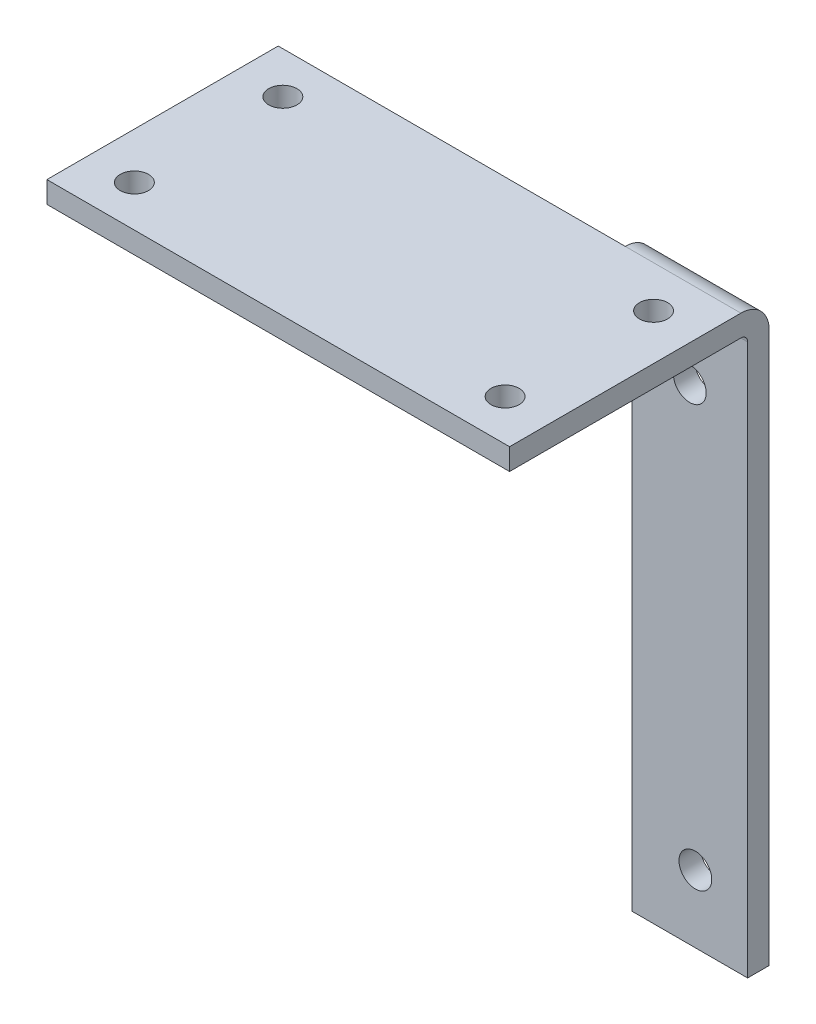
ISO-10303-21;
HEADER;
FILE_DESCRIPTION(('STEP AP214'),'2;1');
FILE_NAME('part.step','',(''),(''),'','','');
FILE_SCHEMA(('AUTOMOTIVE_DESIGN { 1 0 10303 214 1 1 1 1 }'));
ENDSEC;
DATA;
#1=APPLICATION_CONTEXT('core data for automotive mechanical design processes');
#2=APPLICATION_PROTOCOL_DEFINITION('international standard','automotive_design',2000,#1);
#3=PRODUCT_CONTEXT('',#1,'mechanical');
#4=PRODUCT('Part','Part','',(#3));
#5=PRODUCT_RELATED_PRODUCT_CATEGORY('part','',(#4));
#6=PRODUCT_DEFINITION_FORMATION('','',#4);
#7=PRODUCT_DEFINITION_CONTEXT('part definition',#1,'design');
#8=PRODUCT_DEFINITION('design','',#6,#7);
#9=PRODUCT_DEFINITION_SHAPE('','',#8);
#10=(LENGTH_UNIT() NAMED_UNIT(*) SI_UNIT(.MILLI.,.METRE.));
#11=(NAMED_UNIT(*) PLANE_ANGLE_UNIT() SI_UNIT($,.RADIAN.));
#12=(NAMED_UNIT(*) SI_UNIT($,.STERADIAN.) SOLID_ANGLE_UNIT());
#13=UNCERTAINTY_MEASURE_WITH_UNIT(LENGTH_MEASURE(1.E-05),#10,'distance_accuracy_value','');
#14=(GEOMETRIC_REPRESENTATION_CONTEXT(3) GLOBAL_UNCERTAINTY_ASSIGNED_CONTEXT((#13)) GLOBAL_UNIT_ASSIGNED_CONTEXT((#10,
#11,#12)) REPRESENTATION_CONTEXT('',''));
#15=CARTESIAN_POINT('',(0.,0.,0.));
#16=DIRECTION('',(0.,0.,1.));
#17=DIRECTION('',(1.,0.,0.));
#18=AXIS2_PLACEMENT_3D('',#15,#16,#17);
#19=CARTESIAN_POINT('',(0.,25.3135161158946,-26.1366000000001));
#20=DIRECTION('',(0.,0.,1.));
#21=DIRECTION('',(0.,-1.,0.));
#22=AXIS2_PLACEMENT_3D('',#19,#20,#21);
#23=PLANE('',#22);
#24=CARTESIAN_POINT('',(45.06468,-56.1900038841054,-26.1365999999998));
#25=DIRECTION('',(0.,0.,-1.));
#26=DIRECTION('',(0.,1.,0.));
#27=AXIS2_PLACEMENT_3D('',#24,#25,#26);
#28=CIRCLE('',#27,1.79958999999998);
#29=CARTESIAN_POINT('',(45.06468,-54.3904138841054,-26.1365999999998));
#30=VERTEX_POINT('',#29);
#31=EDGE_CURVE('E186',#30,#30,#28,.T.);
#32=ORIENTED_EDGE('',*,*,#31,.T.);
#33=EDGE_LOOP('',(#32));
#34=FACE_BOUND('',#33,.T.);
#35=CARTESIAN_POINT('',(44.45,-10.2464838841054,-26.1366));
#36=DIRECTION('',(0.,0.,-1.));
#37=DIRECTION('',(0.,1.,0.));
#38=AXIS2_PLACEMENT_3D('',#35,#36,#37);
#39=CIRCLE('',#38,1.79958999999999);
#40=CARTESIAN_POINT('',(44.45,-8.44689388410542,-26.1366));
#41=VERTEX_POINT('',#40);
#42=EDGE_CURVE('E221',#41,#41,#39,.T.);
#43=ORIENTED_EDGE('',*,*,#42,.T.);
#44=EDGE_LOOP('',(#43));
#45=FACE_BOUND('',#44,.T.);
#46=DIRECTION('',(1.,0.,0.));
#47=VECTOR('',#46,1.);
#48=CARTESIAN_POINT('',(50.8,-63.5864838841054,-26.1365999999998));
#49=LINE('',#48,#47);
#50=CARTESIAN_POINT('',(50.8,-63.5864838841054,-26.1365999999999));
#51=VERTEX_POINT('',#50);
#52=CARTESIAN_POINT('',(38.1,-63.5864838841054,-26.1365999999998));
#53=VERTEX_POINT('',#52);
#54=EDGE_CURVE('E182',#51,#53,#49,.F.);
#55=ORIENTED_EDGE('',*,*,#54,.F.);
#56=DIRECTION('',(0.,1.,0.));
#57=VECTOR('',#56,1.);
#58=CARTESIAN_POINT('',(50.8,-63.5864838841054,-26.1366));
#59=LINE('',#58,#57);
#60=CARTESIAN_POINT('',(50.8,-3.09880000000001,-26.1366));
#61=VERTEX_POINT('',#60);
#62=EDGE_CURVE('E71',#61,#51,#59,.F.);
#63=ORIENTED_EDGE('',*,*,#62,.F.);
#64=DIRECTION('',(1.,0.,0.));
#65=VECTOR('',#64,1.);
#66=CARTESIAN_POINT('',(31.1856101828211,-3.0988,-26.1366));
#67=LINE('',#66,#65);
#68=CARTESIAN_POINT('',(38.1,-3.0988,-26.1365999999999));
#69=VERTEX_POINT('',#68);
#70=EDGE_CURVE('E189',#61,#69,#67,.F.);
#71=ORIENTED_EDGE('',*,*,#70,.T.);
#72=DIRECTION('',(0.,-1.,0.));
#73=VECTOR('',#72,1.);
#74=CARTESIAN_POINT('',(38.1,-0.0864838841054226,-26.1365999999998));
#75=LINE('',#74,#73);
#76=EDGE_CURVE('E149',#53,#69,#75,.F.);
#77=ORIENTED_EDGE('',*,*,#76,.F.);
#78=EDGE_LOOP('',(#55,#63,#71,#77));
#79=FACE_BOUND('',#78,.T.);
#80=ADVANCED_FACE('F17',(#34,#45,#79),#23,.T.);
#81=CARTESIAN_POINT('',(31.1856101828211,-3.0988,-25.4));
#82=DIRECTION('',(1.,0.,0.));
#83=DIRECTION('',(0.,0.,-1.));
#84=AXIS2_PLACEMENT_3D('',#81,#82,#83);
#85=CYLINDRICAL_SURFACE('',#84,0.7366);
#86=DIRECTION('',(1.,0.,0.));
#87=VECTOR('',#86,1.);
#88=CARTESIAN_POINT('',(0.,-2.3622,-25.4));
#89=LINE('',#88,#87);
#90=CARTESIAN_POINT('',(38.1,-2.3622,-25.4));
#91=VERTEX_POINT('',#90);
#92=CARTESIAN_POINT('',(50.8,-2.3622,-25.4));
#93=VERTEX_POINT('',#92);
#94=EDGE_CURVE('E145',#91,#93,#89,.T.);
#95=ORIENTED_EDGE('',*,*,#94,.F.);
#96=CARTESIAN_POINT('',(38.1,-3.0988,-25.4));
#97=DIRECTION('',(1.,0.,0.));
#98=DIRECTION('',(0.,0.,-1.));
#99=AXIS2_PLACEMENT_3D('',#96,#97,#98);
#100=CIRCLE('',#99,0.7366);
#101=EDGE_CURVE('E20',#69,#91,#100,.T.);
#102=ORIENTED_EDGE('',*,*,#101,.F.);
#103=ORIENTED_EDGE('',*,*,#70,.F.);
#104=CARTESIAN_POINT('',(50.8,-3.0988,-25.4));
#105=DIRECTION('',(1.,0.,0.));
#106=DIRECTION('',(0.,0.,-1.));
#107=AXIS2_PLACEMENT_3D('',#104,#105,#106);
#108=CIRCLE('',#107,0.7366);
#109=EDGE_CURVE('E223',#93,#61,#108,.F.);
#110=ORIENTED_EDGE('',*,*,#109,.F.);
#111=EDGE_LOOP('',(#95,#102,#103,#110));
#112=FACE_BOUND('',#111,.T.);
#113=ADVANCED_FACE('F230',(#112),#85,.F.);
#114=CARTESIAN_POINT('',(44.45,-10.2464838841054,-26.1366));
#115=DIRECTION('',(0.,0.,-1.));
#116=DIRECTION('',(0.,1.,0.));
#117=AXIS2_PLACEMENT_3D('',#114,#115,#116);
#118=CYLINDRICAL_SURFACE('',#117,1.79958999999999);
#119=ORIENTED_EDGE('',*,*,#42,.F.);
#120=EDGE_LOOP('',(#119));
#121=FACE_BOUND('',#120,.T.);
#122=CARTESIAN_POINT('',(44.45,-10.2464838841054,-28.4988));
#123=DIRECTION('',(0.,0.,-1.));
#124=DIRECTION('',(0.,1.,0.));
#125=AXIS2_PLACEMENT_3D('',#122,#123,#124);
#126=CIRCLE('',#125,1.79958999999999);
#127=CARTESIAN_POINT('',(44.45,-8.44689388410543,-28.4988));
#128=VERTEX_POINT('',#127);
#129=EDGE_CURVE('E148',#128,#128,#126,.T.);
#130=ORIENTED_EDGE('',*,*,#129,.T.);
#131=EDGE_LOOP('',(#130));
#132=FACE_BOUND('',#131,.T.);
#133=ADVANCED_FACE('F258',(#121,#132),#118,.F.);
#134=CARTESIAN_POINT('',(45.06468,-56.1900038841054,-26.1365999999998));
#135=DIRECTION('',(0.,0.,-1.));
#136=DIRECTION('',(0.,1.,0.));
#137=AXIS2_PLACEMENT_3D('',#134,#135,#136);
#138=CYLINDRICAL_SURFACE('',#137,1.79958999999998);
#139=ORIENTED_EDGE('',*,*,#31,.F.);
#140=EDGE_LOOP('',(#139));
#141=FACE_BOUND('',#140,.T.);
#142=CARTESIAN_POINT('',(45.06468,-56.1900038841054,-28.4987999999998));
#143=DIRECTION('',(0.,0.,-1.));
#144=DIRECTION('',(0.,1.,0.));
#145=AXIS2_PLACEMENT_3D('',#142,#143,#144);
#146=CIRCLE('',#145,1.79958999999998);
#147=CARTESIAN_POINT('',(45.06468,-54.3904138841054,-28.4987999999998));
#148=VERTEX_POINT('',#147);
#149=EDGE_CURVE('E175',#148,#148,#146,.T.);
#150=ORIENTED_EDGE('',*,*,#149,.T.);
#151=EDGE_LOOP('',(#150));
#152=FACE_BOUND('',#151,.T.);
#153=ADVANCED_FACE('F250',(#141,#152),#138,.F.);
#154=CARTESIAN_POINT('',(50.8,-63.5864838841054,-26.1365999999998));
#155=DIRECTION('',(0.,-1.,0.));
#156=DIRECTION('',(0.,0.,-1.));
#157=AXIS2_PLACEMENT_3D('',#154,#155,#156);
#158=PLANE('',#157);
#159=ORIENTED_EDGE('',*,*,#54,.T.);
#160=DIRECTION('',(0.,0.,1.));
#161=VECTOR('',#160,1.);
#162=CARTESIAN_POINT('',(38.1,-63.5864838841054,-26.1366));
#163=LINE('',#162,#161);
#164=CARTESIAN_POINT('',(38.1,-63.5864838841054,-28.4987999999998));
#165=VERTEX_POINT('',#164);
#166=EDGE_CURVE('E165',#165,#53,#163,.T.);
#167=ORIENTED_EDGE('',*,*,#166,.F.);
#168=DIRECTION('',(1.,0.,0.));
#169=VECTOR('',#168,1.);
#170=CARTESIAN_POINT('',(0.,-63.5864838841054,-28.4987999999998));
#171=LINE('',#170,#169);
#172=CARTESIAN_POINT('',(50.8,-63.5864838841054,-28.4987999999998));
#173=VERTEX_POINT('',#172);
#174=EDGE_CURVE('E142',#165,#173,#171,.T.);
#175=ORIENTED_EDGE('',*,*,#174,.T.);
#176=DIRECTION('',(0.,0.,1.));
#177=VECTOR('',#176,1.);
#178=CARTESIAN_POINT('',(50.8,-63.5864838841054,-26.1365999999998));
#179=LINE('',#178,#177);
#180=EDGE_CURVE('E170',#51,#173,#179,.F.);
#181=ORIENTED_EDGE('',*,*,#180,.F.);
#182=EDGE_LOOP('',(#159,#167,#175,#181));
#183=FACE_BOUND('',#182,.T.);
#184=ADVANCED_FACE('F248',(#183),#158,.T.);
#185=CARTESIAN_POINT('',(0.,-2.3622,0.));
#186=DIRECTION('',(0.,-1.,0.));
#187=DIRECTION('',(0.,0.,-1.));
#188=AXIS2_PLACEMENT_3D('',#185,#186,#187);
#189=PLANE('',#188);
#190=DIRECTION('',(1.,0.,0.));
#191=VECTOR('',#190,1.);
#192=CARTESIAN_POINT('',(0.,-2.3622,0.));
#193=LINE('',#192,#191);
#194=CARTESIAN_POINT('',(0.,-2.3622,0.));
#195=VERTEX_POINT('',#194);
#196=CARTESIAN_POINT('',(50.8,-2.3622,0.));
#197=VERTEX_POINT('',#196);
#198=EDGE_CURVE('E154',#195,#197,#193,.T.);
#199=ORIENTED_EDGE('',*,*,#198,.F.);
#200=DIRECTION('',(0.,0.,1.));
#201=VECTOR('',#200,1.);
#202=CARTESIAN_POINT('',(0.,-2.3622,0.));
#203=LINE('',#202,#201);
#204=CARTESIAN_POINT('',(0.,-2.3622,-25.4));
#205=VERTEX_POINT('',#204);
#206=EDGE_CURVE('E99',#205,#195,#203,.T.);
#207=ORIENTED_EDGE('',*,*,#206,.F.);
#208=DIRECTION('',(-1.,0.,0.));
#209=VECTOR('',#208,1.);
#210=CARTESIAN_POINT('',(0.,-2.3622,-25.4));
#211=LINE('',#210,#209);
#212=EDGE_CURVE('E125',#91,#205,#211,.T.);
#213=ORIENTED_EDGE('',*,*,#212,.F.);
#214=ORIENTED_EDGE('',*,*,#94,.T.);
#215=DIRECTION('',(0.,0.,-1.));
#216=VECTOR('',#215,1.);
#217=CARTESIAN_POINT('',(50.8,-2.3622,-88.9));
#218=LINE('',#217,#216);
#219=EDGE_CURVE('E151',#197,#93,#218,.T.);
#220=ORIENTED_EDGE('',*,*,#219,.F.);
#221=EDGE_LOOP('',(#199,#207,#213,#214,#220));
#222=FACE_BOUND('',#221,.T.);
#223=CARTESIAN_POINT('',(45.78,-2.3622,-20.8280000000001));
#224=DIRECTION('',(0.,1.,0.));
#225=DIRECTION('',(0.,0.,1.));
#226=AXIS2_PLACEMENT_3D('',#223,#224,#225);
#227=CIRCLE('',#226,1.54999999999999);
#228=CARTESIAN_POINT('',(45.78,-2.3622,-19.2780000000001));
#229=VERTEX_POINT('',#228);
#230=EDGE_CURVE('E155',#229,#229,#227,.T.);
#231=ORIENTED_EDGE('',*,*,#230,.T.);
#232=EDGE_LOOP('',(#231));
#233=FACE_BOUND('',#232,.T.);
#234=CARTESIAN_POINT('',(5.08,-2.3622,-4.52800000000005));
#235=DIRECTION('',(0.,1.,0.));
#236=DIRECTION('',(0.,0.,1.));
#237=AXIS2_PLACEMENT_3D('',#234,#235,#236);
#238=CIRCLE('',#237,1.54999999999999);
#239=CARTESIAN_POINT('',(5.08,-2.3622,-2.97800000000006));
#240=VERTEX_POINT('',#239);
#241=EDGE_CURVE('E207',#240,#240,#238,.T.);
#242=ORIENTED_EDGE('',*,*,#241,.T.);
#243=EDGE_LOOP('',(#242));
#244=FACE_BOUND('',#243,.T.);
#245=CARTESIAN_POINT('',(45.78,-2.3622,-4.52800000000005));
#246=DIRECTION('',(0.,1.,0.));
#247=DIRECTION('',(0.,0.,1.));
#248=AXIS2_PLACEMENT_3D('',#245,#246,#247);
#249=CIRCLE('',#248,1.54999999999999);
#250=CARTESIAN_POINT('',(45.78,-2.3622,-2.97800000000006));
#251=VERTEX_POINT('',#250);
#252=EDGE_CURVE('E210',#251,#251,#249,.T.);
#253=ORIENTED_EDGE('',*,*,#252,.T.);
#254=EDGE_LOOP('',(#253));
#255=FACE_BOUND('',#254,.T.);
#256=CARTESIAN_POINT('',(5.08,-2.3622,-20.828));
#257=DIRECTION('',(0.,1.,0.));
#258=DIRECTION('',(0.,0.,1.));
#259=AXIS2_PLACEMENT_3D('',#256,#257,#258);
#260=CIRCLE('',#259,1.55);
#261=CARTESIAN_POINT('',(5.08,-2.3622,-19.278));
#262=VERTEX_POINT('',#261);
#263=EDGE_CURVE('E136',#262,#262,#260,.T.);
#264=ORIENTED_EDGE('',*,*,#263,.T.);
#265=EDGE_LOOP('',(#264));
#266=FACE_BOUND('',#265,.T.);
#267=ADVANCED_FACE('F233',(#222,#233,#244,#255,#266),#189,.T.);
#268=CARTESIAN_POINT('',(0.,25.3135161158946,-28.4988000000001));
#269=DIRECTION('',(0.,0.,1.));
#270=DIRECTION('',(0.,-1.,0.));
#271=AXIS2_PLACEMENT_3D('',#268,#269,#270);
#272=PLANE('',#271);
#273=DIRECTION('',(1.,0.,0.));
#274=VECTOR('',#273,1.);
#275=CARTESIAN_POINT('',(31.1856101828211,-3.0988,-28.4988));
#276=LINE('',#275,#274);
#277=CARTESIAN_POINT('',(50.8,-3.09880000000001,-28.4988));
#278=VERTEX_POINT('',#277);
#279=CARTESIAN_POINT('',(38.1,-3.09880000000001,-28.4988));
#280=VERTEX_POINT('',#279);
#281=EDGE_CURVE('E128',#278,#280,#276,.F.);
#282=ORIENTED_EDGE('',*,*,#281,.F.);
#283=DIRECTION('',(0.,-1.,0.));
#284=VECTOR('',#283,1.);
#285=CARTESIAN_POINT('',(50.8,25.3135161158946,-28.4988000000001));
#286=LINE('',#285,#284);
#287=EDGE_CURVE('E137',#173,#278,#286,.F.);
#288=ORIENTED_EDGE('',*,*,#287,.F.);
#289=ORIENTED_EDGE('',*,*,#174,.F.);
#290=DIRECTION('',(0.,-1.,0.));
#291=VECTOR('',#290,1.);
#292=CARTESIAN_POINT('',(38.1,25.3135161158946,-28.4988000000001));
#293=LINE('',#292,#291);
#294=EDGE_CURVE('E133',#280,#165,#293,.T.);
#295=ORIENTED_EDGE('',*,*,#294,.F.);
#296=EDGE_LOOP('',(#282,#288,#289,#295));
#297=FACE_BOUND('',#296,.T.);
#298=ORIENTED_EDGE('',*,*,#149,.F.);
#299=EDGE_LOOP('',(#298));
#300=FACE_BOUND('',#299,.T.);
#301=ORIENTED_EDGE('',*,*,#129,.F.);
#302=EDGE_LOOP('',(#301));
#303=FACE_BOUND('',#302,.T.);
#304=ADVANCED_FACE('F243',(#297,#300,#303),#272,.F.);
#305=CARTESIAN_POINT('',(38.1,-3.0988,-25.4));
#306=DIRECTION('',(1.,0.,0.));
#307=DIRECTION('',(0.,0.,-1.));
#308=AXIS2_PLACEMENT_3D('',#305,#306,#307);
#309=PLANE('',#308);
#310=CARTESIAN_POINT('',(38.1,-3.0988,-25.4));
#311=DIRECTION('',(1.,0.,0.));
#312=DIRECTION('',(0.,0.,-1.));
#313=AXIS2_PLACEMENT_3D('',#310,#311,#312);
#314=CIRCLE('',#313,3.0988);
#315=CARTESIAN_POINT('',(38.1,0.,-25.4));
#316=VERTEX_POINT('',#315);
#317=EDGE_CURVE('E34',#280,#316,#314,.T.);
#318=ORIENTED_EDGE('',*,*,#317,.F.);
#319=ORIENTED_EDGE('',*,*,#294,.T.);
#320=ORIENTED_EDGE('',*,*,#166,.T.);
#321=ORIENTED_EDGE('',*,*,#76,.T.);
#322=ORIENTED_EDGE('',*,*,#101,.T.);
#323=DIRECTION('',(0.,1.,0.));
#324=VECTOR('',#323,1.);
#325=CARTESIAN_POINT('',(38.1,-2.3622,-25.4));
#326=LINE('',#325,#324);
#327=EDGE_CURVE('E103',#316,#91,#326,.F.);
#328=ORIENTED_EDGE('',*,*,#327,.F.);
#329=EDGE_LOOP('',(#318,#319,#320,#321,#322,#328));
#330=FACE_BOUND('',#329,.T.);
#331=ADVANCED_FACE('F225',(#330),#309,.F.);
#332=CARTESIAN_POINT('',(5.08,-63.5874838841054,-20.828));
#333=DIRECTION('',(0.,1.,0.));
#334=DIRECTION('',(0.,0.,1.));
#335=AXIS2_PLACEMENT_3D('',#332,#333,#334);
#336=CYLINDRICAL_SURFACE('',#335,1.55);
#337=ORIENTED_EDGE('',*,*,#263,.F.);
#338=EDGE_LOOP('',(#337));
#339=FACE_BOUND('',#338,.T.);
#340=CARTESIAN_POINT('',(5.08,0.,-20.828));
#341=DIRECTION('',(0.,1.,0.));
#342=DIRECTION('',(0.,0.,1.));
#343=AXIS2_PLACEMENT_3D('',#340,#341,#342);
#344=CIRCLE('',#343,1.55);
#345=CARTESIAN_POINT('',(5.08,0.,-19.278));
#346=VERTEX_POINT('',#345);
#347=EDGE_CURVE('E200',#346,#346,#344,.T.);
#348=ORIENTED_EDGE('',*,*,#347,.T.);
#349=EDGE_LOOP('',(#348));
#350=FACE_BOUND('',#349,.T.);
#351=ADVANCED_FACE('F287',(#339,#350),#336,.F.);
#352=CARTESIAN_POINT('',(45.78,-63.5874838841054,-4.52800000000005));
#353=DIRECTION('',(0.,1.,0.));
#354=DIRECTION('',(0.,0.,1.));
#355=AXIS2_PLACEMENT_3D('',#352,#353,#354);
#356=CYLINDRICAL_SURFACE('',#355,1.54999999999999);
#357=ORIENTED_EDGE('',*,*,#252,.F.);
#358=EDGE_LOOP('',(#357));
#359=FACE_BOUND('',#358,.T.);
#360=CARTESIAN_POINT('',(45.78,0.,-4.52800000000005));
#361=DIRECTION('',(0.,1.,0.));
#362=DIRECTION('',(0.,0.,1.));
#363=AXIS2_PLACEMENT_3D('',#360,#361,#362);
#364=CIRCLE('',#363,1.54999999999999);
#365=CARTESIAN_POINT('',(45.78,0.,-2.97800000000006));
#366=VERTEX_POINT('',#365);
#367=EDGE_CURVE('E197',#366,#366,#364,.T.);
#368=ORIENTED_EDGE('',*,*,#367,.T.);
#369=EDGE_LOOP('',(#368));
#370=FACE_BOUND('',#369,.T.);
#371=ADVANCED_FACE('F283',(#359,#370),#356,.F.);
#372=CARTESIAN_POINT('',(5.08,-63.5874838841054,-4.52800000000005));
#373=DIRECTION('',(0.,1.,0.));
#374=DIRECTION('',(0.,0.,1.));
#375=AXIS2_PLACEMENT_3D('',#372,#373,#374);
#376=CYLINDRICAL_SURFACE('',#375,1.54999999999999);
#377=ORIENTED_EDGE('',*,*,#241,.F.);
#378=EDGE_LOOP('',(#377));
#379=FACE_BOUND('',#378,.T.);
#380=CARTESIAN_POINT('',(5.08,0.,-4.52800000000005));
#381=DIRECTION('',(0.,1.,0.));
#382=DIRECTION('',(0.,0.,1.));
#383=AXIS2_PLACEMENT_3D('',#380,#381,#382);
#384=CIRCLE('',#383,1.54999999999999);
#385=CARTESIAN_POINT('',(5.08,0.,-2.97800000000006));
#386=VERTEX_POINT('',#385);
#387=EDGE_CURVE('E194',#386,#386,#384,.T.);
#388=ORIENTED_EDGE('',*,*,#387,.T.);
#389=EDGE_LOOP('',(#388));
#390=FACE_BOUND('',#389,.T.);
#391=ADVANCED_FACE('F279',(#379,#390),#376,.F.);
#392=CARTESIAN_POINT('',(45.78,-63.5874838841054,-20.8280000000001));
#393=DIRECTION('',(0.,1.,0.));
#394=DIRECTION('',(0.,0.,1.));
#395=AXIS2_PLACEMENT_3D('',#392,#393,#394);
#396=CYLINDRICAL_SURFACE('',#395,1.54999999999999);
#397=ORIENTED_EDGE('',*,*,#230,.F.);
#398=EDGE_LOOP('',(#397));
#399=FACE_BOUND('',#398,.T.);
#400=CARTESIAN_POINT('',(45.78,0.,-20.8280000000001));
#401=DIRECTION('',(0.,1.,0.));
#402=DIRECTION('',(0.,0.,1.));
#403=AXIS2_PLACEMENT_3D('',#400,#401,#402);
#404=CIRCLE('',#403,1.54999999999999);
#405=CARTESIAN_POINT('',(45.78,0.,-19.2780000000001));
#406=VERTEX_POINT('',#405);
#407=EDGE_CURVE('E120',#406,#406,#404,.T.);
#408=ORIENTED_EDGE('',*,*,#407,.T.);
#409=EDGE_LOOP('',(#408));
#410=FACE_BOUND('',#409,.T.);
#411=ADVANCED_FACE('F276',(#399,#410),#396,.F.);
#412=CARTESIAN_POINT('',(50.8,-2.3622,-88.9));
#413=DIRECTION('',(1.,0.,0.));
#414=DIRECTION('',(0.,0.,-1.));
#415=AXIS2_PLACEMENT_3D('',#412,#413,#414);
#416=PLANE('',#415);
#417=DIRECTION('',(0.,0.,-1.));
#418=VECTOR('',#417,1.);
#419=CARTESIAN_POINT('',(50.8,0.,0.));
#420=LINE('',#419,#418);
#421=CARTESIAN_POINT('',(50.8,0.,-25.4));
#422=VERTEX_POINT('',#421);
#423=CARTESIAN_POINT('',(50.8,0.,0.));
#424=VERTEX_POINT('',#423);
#425=EDGE_CURVE('E118',#422,#424,#420,.F.);
#426=ORIENTED_EDGE('',*,*,#425,.T.);
#427=DIRECTION('',(0.,1.,0.));
#428=VECTOR('',#427,1.);
#429=CARTESIAN_POINT('',(50.8,-2.3622,0.));
#430=LINE('',#429,#428);
#431=EDGE_CURVE('E117',#197,#424,#430,.T.);
#432=ORIENTED_EDGE('',*,*,#431,.F.);
#433=ORIENTED_EDGE('',*,*,#219,.T.);
#434=ORIENTED_EDGE('',*,*,#109,.T.);
#435=ORIENTED_EDGE('',*,*,#62,.T.);
#436=ORIENTED_EDGE('',*,*,#180,.T.);
#437=ORIENTED_EDGE('',*,*,#287,.T.);
#438=CARTESIAN_POINT('',(50.8,-3.0988,-25.4));
#439=DIRECTION('',(1.,0.,0.));
#440=DIRECTION('',(0.,0.,-1.));
#441=AXIS2_PLACEMENT_3D('',#438,#439,#440);
#442=CIRCLE('',#441,3.0988);
#443=EDGE_CURVE('E124',#422,#278,#442,.F.);
#444=ORIENTED_EDGE('',*,*,#443,.F.);
#445=EDGE_LOOP('',(#426,#432,#433,#434,#435,#436,#437,#444));
#446=FACE_BOUND('',#445,.T.);
#447=ADVANCED_FACE('F235',(#446),#416,.T.);
#448=CARTESIAN_POINT('',(0.,-2.3622,0.));
#449=DIRECTION('',(0.,0.,1.));
#450=DIRECTION('',(1.,0.,0.));
#451=AXIS2_PLACEMENT_3D('',#448,#449,#450);
#452=PLANE('',#451);
#453=ORIENTED_EDGE('',*,*,#198,.T.);
#454=ORIENTED_EDGE('',*,*,#431,.T.);
#455=DIRECTION('',(1.,0.,0.));
#456=VECTOR('',#455,1.);
#457=CARTESIAN_POINT('',(0.,0.,0.));
#458=LINE('',#457,#456);
#459=CARTESIAN_POINT('',(0.,0.,0.));
#460=VERTEX_POINT('',#459);
#461=EDGE_CURVE('E110',#424,#460,#458,.F.);
#462=ORIENTED_EDGE('',*,*,#461,.T.);
#463=DIRECTION('',(0.,1.,0.));
#464=VECTOR('',#463,1.);
#465=CARTESIAN_POINT('',(0.,-2.3622,0.));
#466=LINE('',#465,#464);
#467=EDGE_CURVE('E93',#195,#460,#466,.T.);
#468=ORIENTED_EDGE('',*,*,#467,.F.);
#469=EDGE_LOOP('',(#453,#454,#462,#468));
#470=FACE_BOUND('',#469,.T.);
#471=ADVANCED_FACE('F115',(#470),#452,.T.);
#472=CARTESIAN_POINT('',(0.,-2.3622,0.));
#473=DIRECTION('',(-1.,0.,0.));
#474=DIRECTION('',(0.,0.,1.));
#475=AXIS2_PLACEMENT_3D('',#472,#473,#474);
#476=PLANE('',#475);
#477=ORIENTED_EDGE('',*,*,#206,.T.);
#478=ORIENTED_EDGE('',*,*,#467,.T.);
#479=DIRECTION('',(0.,0.,-1.));
#480=VECTOR('',#479,1.);
#481=CARTESIAN_POINT('',(0.,0.,0.));
#482=LINE('',#481,#480);
#483=CARTESIAN_POINT('',(0.,0.,-25.4));
#484=VERTEX_POINT('',#483);
#485=EDGE_CURVE('E97',#460,#484,#482,.T.);
#486=ORIENTED_EDGE('',*,*,#485,.T.);
#487=DIRECTION('',(0.,1.,0.));
#488=VECTOR('',#487,1.);
#489=CARTESIAN_POINT('',(0.,-2.3622,-25.4));
#490=LINE('',#489,#488);
#491=EDGE_CURVE('E123',#205,#484,#490,.T.);
#492=ORIENTED_EDGE('',*,*,#491,.F.);
#493=EDGE_LOOP('',(#477,#478,#486,#492));
#494=FACE_BOUND('',#493,.T.);
#495=ADVANCED_FACE('F95',(#494),#476,.T.);
#496=CARTESIAN_POINT('',(0.,-2.3622,-25.4));
#497=DIRECTION('',(0.,0.,-1.));
#498=DIRECTION('',(-1.,0.,0.));
#499=AXIS2_PLACEMENT_3D('',#496,#497,#498);
#500=PLANE('',#499);
#501=ORIENTED_EDGE('',*,*,#212,.T.);
#502=ORIENTED_EDGE('',*,*,#491,.T.);
#503=DIRECTION('',(1.,0.,0.));
#504=VECTOR('',#503,1.);
#505=CARTESIAN_POINT('',(0.,0.,-25.4));
#506=LINE('',#505,#504);
#507=EDGE_CURVE('E26',#484,#316,#506,.T.);
#508=ORIENTED_EDGE('',*,*,#507,.T.);
#509=ORIENTED_EDGE('',*,*,#327,.T.);
#510=EDGE_LOOP('',(#501,#502,#508,#509));
#511=FACE_BOUND('',#510,.T.);
#512=ADVANCED_FACE('F228',(#511),#500,.T.);
#513=CARTESIAN_POINT('',(31.1856101828211,-3.0988,-25.4));
#514=DIRECTION('',(1.,0.,0.));
#515=DIRECTION('',(0.,0.,-1.));
#516=AXIS2_PLACEMENT_3D('',#513,#514,#515);
#517=CYLINDRICAL_SURFACE('',#516,3.0988);
#518=ORIENTED_EDGE('',*,*,#317,.T.);
#519=DIRECTION('',(1.,0.,0.));
#520=VECTOR('',#519,1.);
#521=CARTESIAN_POINT('',(0.,0.,-25.4));
#522=LINE('',#521,#520);
#523=EDGE_CURVE('E11',#316,#422,#522,.T.);
#524=ORIENTED_EDGE('',*,*,#523,.T.);
#525=ORIENTED_EDGE('',*,*,#443,.T.);
#526=ORIENTED_EDGE('',*,*,#281,.T.);
#527=EDGE_LOOP('',(#518,#524,#525,#526));
#528=FACE_BOUND('',#527,.T.);
#529=ADVANCED_FACE('F237',(#528),#517,.T.);
#530=CARTESIAN_POINT('',(0.,0.,0.));
#531=DIRECTION('',(0.,-1.,0.));
#532=DIRECTION('',(0.,0.,-1.));
#533=AXIS2_PLACEMENT_3D('',#530,#531,#532);
#534=PLANE('',#533);
#535=ORIENTED_EDGE('',*,*,#507,.F.);
#536=ORIENTED_EDGE('',*,*,#485,.F.);
#537=ORIENTED_EDGE('',*,*,#461,.F.);
#538=ORIENTED_EDGE('',*,*,#425,.F.);
#539=ORIENTED_EDGE('',*,*,#523,.F.);
#540=EDGE_LOOP('',(#535,#536,#537,#538,#539));
#541=FACE_BOUND('',#540,.T.);
#542=ORIENTED_EDGE('',*,*,#407,.F.);
#543=EDGE_LOOP('',(#542));
#544=FACE_BOUND('',#543,.T.);
#545=ORIENTED_EDGE('',*,*,#387,.F.);
#546=EDGE_LOOP('',(#545));
#547=FACE_BOUND('',#546,.T.);
#548=ORIENTED_EDGE('',*,*,#367,.F.);
#549=EDGE_LOOP('',(#548));
#550=FACE_BOUND('',#549,.T.);
#551=ORIENTED_EDGE('',*,*,#347,.F.);
#552=EDGE_LOOP('',(#551));
#553=FACE_BOUND('',#552,.T.);
#554=ADVANCED_FACE('F108',(#541,#544,#547,#550,#553),#534,.F.);
#555=CLOSED_SHELL('',(#80,#113,#133,#153,#184,#267,#304,#331,#351,#371,#391,#411,#447,#471,#495,
#512,#529,#554));
#556=MANIFOLD_SOLID_BREP('B1',#555);
#557=ADVANCED_BREP_SHAPE_REPRESENTATION('',(#18,#556),#14);
#558=SHAPE_DEFINITION_REPRESENTATION(#9,#557);
ENDSEC;
END-ISO-10303-21;
